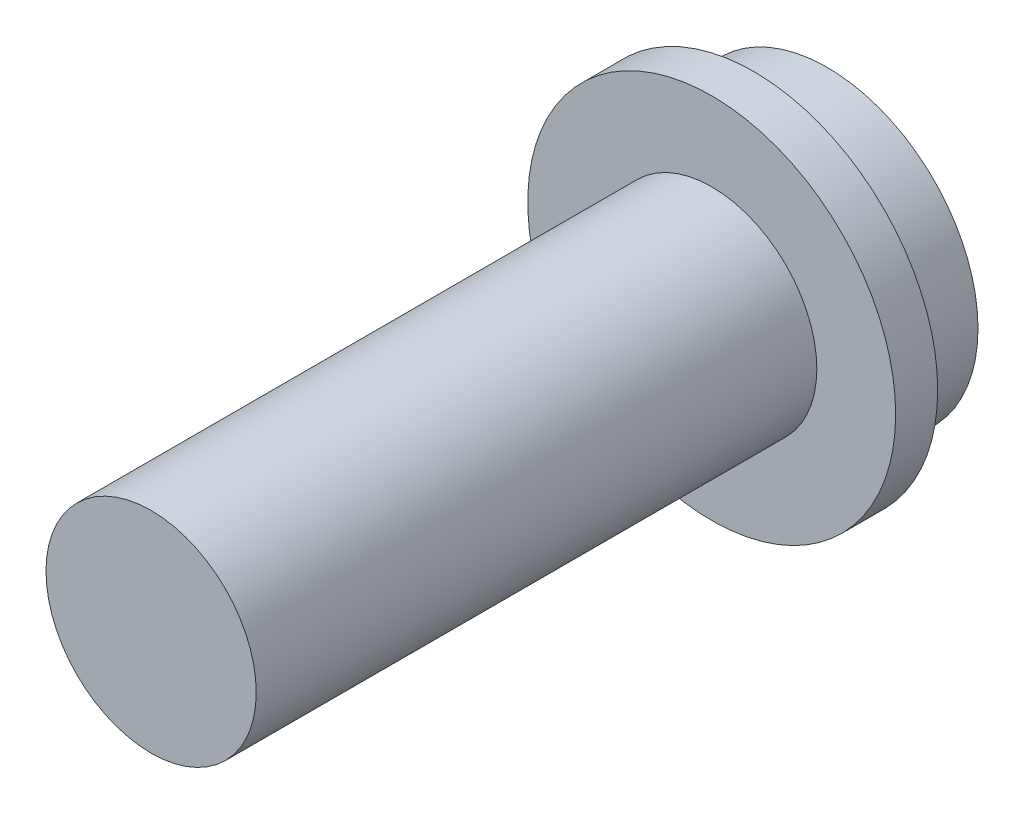
ISO-10303-21;
HEADER;
FILE_DESCRIPTION(('STEP AP214'),'2;1');
FILE_NAME('part.step','',(''),(''),'','','');
FILE_SCHEMA(('AUTOMOTIVE_DESIGN { 1 0 10303 214 1 1 1 1 }'));
ENDSEC;
DATA;
#1=APPLICATION_CONTEXT('core data for automotive mechanical design processes');
#2=APPLICATION_PROTOCOL_DEFINITION('international standard','automotive_design',2000,#1);
#3=PRODUCT_CONTEXT('',#1,'mechanical');
#4=PRODUCT('Part','Part','',(#3));
#5=PRODUCT_RELATED_PRODUCT_CATEGORY('part','',(#4));
#6=PRODUCT_DEFINITION_FORMATION('','',#4);
#7=PRODUCT_DEFINITION_CONTEXT('part definition',#1,'design');
#8=PRODUCT_DEFINITION('design','',#6,#7);
#9=PRODUCT_DEFINITION_SHAPE('','',#8);
#10=(LENGTH_UNIT() NAMED_UNIT(*) SI_UNIT(.MILLI.,.METRE.));
#11=(NAMED_UNIT(*) PLANE_ANGLE_UNIT() SI_UNIT($,.RADIAN.));
#12=(NAMED_UNIT(*) SI_UNIT($,.STERADIAN.) SOLID_ANGLE_UNIT());
#13=UNCERTAINTY_MEASURE_WITH_UNIT(LENGTH_MEASURE(1.E-05),#10,'distance_accuracy_value','');
#14=(GEOMETRIC_REPRESENTATION_CONTEXT(3) GLOBAL_UNCERTAINTY_ASSIGNED_CONTEXT((#13)) GLOBAL_UNIT_ASSIGNED_CONTEXT((#10,
#11,#12)) REPRESENTATION_CONTEXT('',''));
#15=CARTESIAN_POINT('',(0.,0.,0.));
#16=DIRECTION('',(0.,0.,1.));
#17=DIRECTION('',(1.,0.,0.));
#18=AXIS2_PLACEMENT_3D('',#15,#16,#17);
#19=CARTESIAN_POINT('',(0.,0.,-3.3));
#20=DIRECTION('',(0.,0.,1.));
#21=DIRECTION('',(1.,0.,0.));
#22=AXIS2_PLACEMENT_3D('',#19,#20,#21);
#23=PLANE('',#22);
#24=CARTESIAN_POINT('',(0.,0.,-3.3));
#25=DIRECTION('',(0.,0.,1.));
#26=DIRECTION('',(1.,0.,0.));
#27=AXIS2_PLACEMENT_3D('',#24,#25,#26);
#28=CIRCLE('',#27,4.3);
#29=CARTESIAN_POINT('',(4.3,0.,-3.3));
#30=VERTEX_POINT('',#29);
#31=EDGE_CURVE('E110',#30,#30,#28,.T.);
#32=ORIENTED_EDGE('',*,*,#31,.F.);
#33=EDGE_LOOP('',(#32));
#34=FACE_BOUND('',#33,.T.);
#35=DIRECTION('',(-0.5,-0.866025403784439,0.));
#36=VECTOR('',#35,1.);
#37=CARTESIAN_POINT('',(1.73205080756888,-1.,-3.3));
#38=LINE('',#37,#36);
#39=CARTESIAN_POINT('',(2.3094010767585,0.,-3.3));
#40=VERTEX_POINT('',#39);
#41=CARTESIAN_POINT('',(1.15470053837925,-2.,-3.3));
#42=VERTEX_POINT('',#41);
#43=EDGE_CURVE('E11',#40,#42,#38,.T.);
#44=ORIENTED_EDGE('',*,*,#43,.F.);
#45=DIRECTION('',(0.5,-0.866025403784439,0.));
#46=VECTOR('',#45,1.);
#47=CARTESIAN_POINT('',(1.73205080756888,1.,-3.3));
#48=LINE('',#47,#46);
#49=CARTESIAN_POINT('',(1.15470053837925,2.,-3.3));
#50=VERTEX_POINT('',#49);
#51=EDGE_CURVE('E50',#50,#40,#48,.T.);
#52=ORIENTED_EDGE('',*,*,#51,.F.);
#53=DIRECTION('',(1.,0.,0.));
#54=VECTOR('',#53,1.);
#55=CARTESIAN_POINT('',(0.,2.,-3.3));
#56=LINE('',#55,#54);
#57=CARTESIAN_POINT('',(-1.15470053837925,2.,-3.3));
#58=VERTEX_POINT('',#57);
#59=EDGE_CURVE('E140',#58,#50,#56,.T.);
#60=ORIENTED_EDGE('',*,*,#59,.F.);
#61=DIRECTION('',(0.5,0.866025403784438,0.));
#62=VECTOR('',#61,1.);
#63=CARTESIAN_POINT('',(-1.73205080756888,1.,-3.3));
#64=LINE('',#63,#62);
#65=CARTESIAN_POINT('',(-2.3094010767585,0.,-3.3));
#66=VERTEX_POINT('',#65);
#67=EDGE_CURVE('E133',#66,#58,#64,.T.);
#68=ORIENTED_EDGE('',*,*,#67,.F.);
#69=DIRECTION('',(-0.5,0.866025403784439,0.));
#70=VECTOR('',#69,1.);
#71=CARTESIAN_POINT('',(-1.73205080756888,-1.,-3.3));
#72=LINE('',#71,#70);
#73=CARTESIAN_POINT('',(-1.15470053837925,-2.,-3.3));
#74=VERTEX_POINT('',#73);
#75=EDGE_CURVE('E135',#74,#66,#72,.T.);
#76=ORIENTED_EDGE('',*,*,#75,.F.);
#77=DIRECTION('',(-1.,0.,0.));
#78=VECTOR('',#77,1.);
#79=CARTESIAN_POINT('',(0.,-2.,-3.3));
#80=LINE('',#79,#78);
#81=EDGE_CURVE('E126',#42,#74,#80,.T.);
#82=ORIENTED_EDGE('',*,*,#81,.F.);
#83=EDGE_LOOP('',(#44,#52,#60,#68,#76,#82));
#84=FACE_BOUND('',#83,.T.);
#85=ADVANCED_FACE('F39',(#34,#84),#23,.F.);
#86=CARTESIAN_POINT('',(0.,0.,16.));
#87=DIRECTION('',(0.,0.,-1.));
#88=DIRECTION('',(-1.,0.,0.));
#89=AXIS2_PLACEMENT_3D('',#86,#87,#88);
#90=CYLINDRICAL_SURFACE('',#89,3.);
#91=CARTESIAN_POINT('',(0.,0.,16.));
#92=DIRECTION('',(0.,0.,1.));
#93=DIRECTION('',(1.,0.,0.));
#94=AXIS2_PLACEMENT_3D('',#91,#92,#93);
#95=CIRCLE('',#94,3.);
#96=CARTESIAN_POINT('',(3.,0.,16.));
#97=VERTEX_POINT('',#96);
#98=EDGE_CURVE('E127',#97,#97,#95,.T.);
#99=ORIENTED_EDGE('',*,*,#98,.F.);
#100=EDGE_LOOP('',(#99));
#101=FACE_BOUND('',#100,.T.);
#102=CARTESIAN_POINT('',(0.,0.,0.));
#103=DIRECTION('',(0.,0.,1.));
#104=DIRECTION('',(1.,0.,0.));
#105=AXIS2_PLACEMENT_3D('',#102,#103,#104);
#106=CIRCLE('',#105,3.);
#107=CARTESIAN_POINT('',(3.,0.,0.));
#108=VERTEX_POINT('',#107);
#109=EDGE_CURVE('E124',#108,#108,#106,.T.);
#110=ORIENTED_EDGE('',*,*,#109,.T.);
#111=EDGE_LOOP('',(#110));
#112=FACE_BOUND('',#111,.T.);
#113=ADVANCED_FACE('F41',(#101,#112),#90,.T.);
#114=CARTESIAN_POINT('',(0.,0.,16.));
#115=DIRECTION('',(0.,0.,1.));
#116=DIRECTION('',(1.,0.,0.));
#117=AXIS2_PLACEMENT_3D('',#114,#115,#116);
#118=PLANE('',#117);
#119=ORIENTED_EDGE('',*,*,#98,.T.);
#120=EDGE_LOOP('',(#119));
#121=FACE_BOUND('',#120,.T.);
#122=ADVANCED_FACE('F184',(#121),#118,.T.);
#123=CARTESIAN_POINT('',(0.,0.,0.));
#124=DIRECTION('',(0.,0.,-1.));
#125=DIRECTION('',(-1.,0.,0.));
#126=AXIS2_PLACEMENT_3D('',#123,#124,#125);
#127=CYLINDRICAL_SURFACE('',#126,5.25);
#128=CARTESIAN_POINT('',(0.,0.,0.));
#129=DIRECTION('',(0.,0.,1.));
#130=DIRECTION('',(1.,0.,0.));
#131=AXIS2_PLACEMENT_3D('',#128,#129,#130);
#132=CIRCLE('',#131,5.25);
#133=CARTESIAN_POINT('',(5.25,0.,0.));
#134=VERTEX_POINT('',#133);
#135=EDGE_CURVE('E119',#134,#134,#132,.T.);
#136=ORIENTED_EDGE('',*,*,#135,.F.);
#137=EDGE_LOOP('',(#136));
#138=FACE_BOUND('',#137,.T.);
#139=CARTESIAN_POINT('',(0.,0.,-1.2));
#140=DIRECTION('',(0.,0.,1.));
#141=DIRECTION('',(1.,0.,0.));
#142=AXIS2_PLACEMENT_3D('',#139,#140,#141);
#143=CIRCLE('',#142,5.25);
#144=CARTESIAN_POINT('',(5.25,0.,-1.2));
#145=VERTEX_POINT('',#144);
#146=EDGE_CURVE('E117',#145,#145,#143,.T.);
#147=ORIENTED_EDGE('',*,*,#146,.T.);
#148=EDGE_LOOP('',(#147));
#149=FACE_BOUND('',#148,.T.);
#150=ADVANCED_FACE('F200',(#138,#149),#127,.T.);
#151=CARTESIAN_POINT('',(0.,0.,0.));
#152=DIRECTION('',(0.,0.,1.));
#153=DIRECTION('',(1.,0.,0.));
#154=AXIS2_PLACEMENT_3D('',#151,#152,#153);
#155=PLANE('',#154);
#156=ORIENTED_EDGE('',*,*,#109,.F.);
#157=EDGE_LOOP('',(#156));
#158=FACE_BOUND('',#157,.T.);
#159=ORIENTED_EDGE('',*,*,#135,.T.);
#160=EDGE_LOOP('',(#159));
#161=FACE_BOUND('',#160,.T.);
#162=ADVANCED_FACE('F193',(#158,#161),#155,.T.);
#163=CARTESIAN_POINT('',(0.,0.,-1.2));
#164=DIRECTION('',(0.,0.,1.));
#165=DIRECTION('',(1.,0.,0.));
#166=AXIS2_PLACEMENT_3D('',#163,#164,#165);
#167=PLANE('',#166);
#168=CARTESIAN_POINT('',(0.,0.,-1.2));
#169=DIRECTION('',(0.,0.,1.));
#170=DIRECTION('',(1.,0.,0.));
#171=AXIS2_PLACEMENT_3D('',#168,#169,#170);
#172=CIRCLE('',#171,4.3);
#173=CARTESIAN_POINT('',(4.3,0.,-1.2));
#174=VERTEX_POINT('',#173);
#175=EDGE_CURVE('E111',#174,#174,#172,.T.);
#176=ORIENTED_EDGE('',*,*,#175,.T.);
#177=EDGE_LOOP('',(#176));
#178=FACE_BOUND('',#177,.T.);
#179=ORIENTED_EDGE('',*,*,#146,.F.);
#180=EDGE_LOOP('',(#179));
#181=FACE_BOUND('',#180,.T.);
#182=ADVANCED_FACE('F194',(#178,#181),#167,.F.);
#183=CARTESIAN_POINT('',(0.,0.,-1.2));
#184=DIRECTION('',(0.,0.,-1.));
#185=DIRECTION('',(-1.,0.,0.));
#186=AXIS2_PLACEMENT_3D('',#183,#184,#185);
#187=CYLINDRICAL_SURFACE('',#186,4.3);
#188=ORIENTED_EDGE('',*,*,#175,.F.);
#189=EDGE_LOOP('',(#188));
#190=FACE_BOUND('',#189,.T.);
#191=ORIENTED_EDGE('',*,*,#31,.T.);
#192=EDGE_LOOP('',(#191));
#193=FACE_BOUND('',#192,.T.);
#194=ADVANCED_FACE('F192',(#190,#193),#187,.T.);
#195=CARTESIAN_POINT('',(1.15470053837925,-2.,-1.2));
#196=DIRECTION('',(-0.866025403784439,0.5,0.));
#197=DIRECTION('',(-0.5,-0.866025403784439,0.));
#198=AXIS2_PLACEMENT_3D('',#195,#196,#197);
#199=PLANE('',#198);
#200=ORIENTED_EDGE('',*,*,#43,.T.);
#201=DIRECTION('',(0.,0.,-1.));
#202=VECTOR('',#201,1.);
#203=CARTESIAN_POINT('',(1.15470053837925,-2.,-1.2));
#204=LINE('',#203,#202);
#205=CARTESIAN_POINT('',(1.15470053837925,-2.,-1.2));
#206=VERTEX_POINT('',#205);
#207=EDGE_CURVE('E53',#206,#42,#204,.T.);
#208=ORIENTED_EDGE('',*,*,#207,.F.);
#209=DIRECTION('',(0.5,0.866025403784439,0.));
#210=VECTOR('',#209,1.);
#211=CARTESIAN_POINT('',(1.15470053837925,-2.,-1.2));
#212=LINE('',#211,#210);
#213=CARTESIAN_POINT('',(2.3094010767585,0.,-1.2));
#214=VERTEX_POINT('',#213);
#215=EDGE_CURVE('E98',#206,#214,#212,.T.);
#216=ORIENTED_EDGE('',*,*,#215,.T.);
#217=DIRECTION('',(0.,0.,-1.));
#218=VECTOR('',#217,1.);
#219=CARTESIAN_POINT('',(2.3094010767585,0.,-1.2));
#220=LINE('',#219,#218);
#221=EDGE_CURVE('E101',#214,#40,#220,.T.);
#222=ORIENTED_EDGE('',*,*,#221,.T.);
#223=EDGE_LOOP('',(#200,#208,#216,#222));
#224=FACE_BOUND('',#223,.T.);
#225=ADVANCED_FACE('F105',(#224),#199,.T.);
#226=CARTESIAN_POINT('',(2.3094010767585,0.,-1.2));
#227=DIRECTION('',(-0.866025403784439,-0.5,0.));
#228=DIRECTION('',(0.5,-0.866025403784439,0.));
#229=AXIS2_PLACEMENT_3D('',#226,#227,#228);
#230=PLANE('',#229);
#231=ORIENTED_EDGE('',*,*,#51,.T.);
#232=ORIENTED_EDGE('',*,*,#221,.F.);
#233=DIRECTION('',(-0.5,0.866025403784439,0.));
#234=VECTOR('',#233,1.);
#235=CARTESIAN_POINT('',(2.3094010767585,0.,-1.2));
#236=LINE('',#235,#234);
#237=CARTESIAN_POINT('',(1.15470053837925,2.,-1.2));
#238=VERTEX_POINT('',#237);
#239=EDGE_CURVE('E95',#214,#238,#236,.T.);
#240=ORIENTED_EDGE('',*,*,#239,.T.);
#241=DIRECTION('',(0.,0.,-1.));
#242=VECTOR('',#241,1.);
#243=CARTESIAN_POINT('',(1.15470053837925,2.,-1.2));
#244=LINE('',#243,#242);
#245=EDGE_CURVE('E108',#238,#50,#244,.T.);
#246=ORIENTED_EDGE('',*,*,#245,.T.);
#247=EDGE_LOOP('',(#231,#232,#240,#246));
#248=FACE_BOUND('',#247,.T.);
#249=ADVANCED_FACE('F106',(#248),#230,.T.);
#250=CARTESIAN_POINT('',(1.15470053837925,2.,-1.2));
#251=DIRECTION('',(0.,-1.,0.));
#252=DIRECTION('',(1.,0.,0.));
#253=AXIS2_PLACEMENT_3D('',#250,#251,#252);
#254=PLANE('',#253);
#255=ORIENTED_EDGE('',*,*,#59,.T.);
#256=ORIENTED_EDGE('',*,*,#245,.F.);
#257=DIRECTION('',(-1.,0.,0.));
#258=VECTOR('',#257,1.);
#259=CARTESIAN_POINT('',(1.15470053837925,2.,-1.2));
#260=LINE('',#259,#258);
#261=CARTESIAN_POINT('',(-1.15470053837925,2.,-1.2));
#262=VERTEX_POINT('',#261);
#263=EDGE_CURVE('E96',#238,#262,#260,.T.);
#264=ORIENTED_EDGE('',*,*,#263,.T.);
#265=DIRECTION('',(0.,0.,-1.));
#266=VECTOR('',#265,1.);
#267=CARTESIAN_POINT('',(-1.15470053837925,2.,-1.2));
#268=LINE('',#267,#266);
#269=EDGE_CURVE('E113',#262,#58,#268,.T.);
#270=ORIENTED_EDGE('',*,*,#269,.T.);
#271=EDGE_LOOP('',(#255,#256,#264,#270));
#272=FACE_BOUND('',#271,.T.);
#273=ADVANCED_FACE('F142',(#272),#254,.T.);
#274=CARTESIAN_POINT('',(-1.15470053837925,2.,-1.2));
#275=DIRECTION('',(0.866025403784438,-0.5,0.));
#276=DIRECTION('',(0.5,0.866025403784438,0.));
#277=AXIS2_PLACEMENT_3D('',#274,#275,#276);
#278=PLANE('',#277);
#279=ORIENTED_EDGE('',*,*,#67,.T.);
#280=ORIENTED_EDGE('',*,*,#269,.F.);
#281=DIRECTION('',(-0.5,-0.866025403784438,0.));
#282=VECTOR('',#281,1.);
#283=CARTESIAN_POINT('',(-1.15470053837925,2.,-1.2));
#284=LINE('',#283,#282);
#285=CARTESIAN_POINT('',(-2.3094010767585,0.,-1.2));
#286=VERTEX_POINT('',#285);
#287=EDGE_CURVE('E164',#262,#286,#284,.T.);
#288=ORIENTED_EDGE('',*,*,#287,.T.);
#289=DIRECTION('',(0.,0.,-1.));
#290=VECTOR('',#289,1.);
#291=CARTESIAN_POINT('',(-2.3094010767585,0.,-1.2));
#292=LINE('',#291,#290);
#293=EDGE_CURVE('E160',#286,#66,#292,.T.);
#294=ORIENTED_EDGE('',*,*,#293,.T.);
#295=EDGE_LOOP('',(#279,#280,#288,#294));
#296=FACE_BOUND('',#295,.T.);
#297=ADVANCED_FACE('F166',(#296),#278,.T.);
#298=CARTESIAN_POINT('',(-2.3094010767585,0.,-1.2));
#299=DIRECTION('',(0.866025403784439,0.5,0.));
#300=DIRECTION('',(-0.5,0.866025403784439,0.));
#301=AXIS2_PLACEMENT_3D('',#298,#299,#300);
#302=PLANE('',#301);
#303=ORIENTED_EDGE('',*,*,#75,.T.);
#304=ORIENTED_EDGE('',*,*,#293,.F.);
#305=DIRECTION('',(0.5,-0.866025403784439,0.));
#306=VECTOR('',#305,1.);
#307=CARTESIAN_POINT('',(-2.3094010767585,0.,-1.2));
#308=LINE('',#307,#306);
#309=CARTESIAN_POINT('',(-1.15470053837925,-2.,-1.2));
#310=VERTEX_POINT('',#309);
#311=EDGE_CURVE('E157',#286,#310,#308,.T.);
#312=ORIENTED_EDGE('',*,*,#311,.T.);
#313=DIRECTION('',(0.,0.,-1.));
#314=VECTOR('',#313,1.);
#315=CARTESIAN_POINT('',(-1.15470053837925,-2.,-1.2));
#316=LINE('',#315,#314);
#317=EDGE_CURVE('E148',#310,#74,#316,.T.);
#318=ORIENTED_EDGE('',*,*,#317,.T.);
#319=EDGE_LOOP('',(#303,#304,#312,#318));
#320=FACE_BOUND('',#319,.T.);
#321=ADVANCED_FACE('F154',(#320),#302,.T.);
#322=CARTESIAN_POINT('',(-1.15470053837925,-2.,-1.2));
#323=DIRECTION('',(0.,1.,0.));
#324=DIRECTION('',(-1.,0.,0.));
#325=AXIS2_PLACEMENT_3D('',#322,#323,#324);
#326=PLANE('',#325);
#327=ORIENTED_EDGE('',*,*,#81,.T.);
#328=ORIENTED_EDGE('',*,*,#317,.F.);
#329=DIRECTION('',(1.,0.,0.));
#330=VECTOR('',#329,1.);
#331=CARTESIAN_POINT('',(-1.15470053837925,-2.,-1.2));
#332=LINE('',#331,#330);
#333=EDGE_CURVE('E156',#310,#206,#332,.T.);
#334=ORIENTED_EDGE('',*,*,#333,.T.);
#335=ORIENTED_EDGE('',*,*,#207,.T.);
#336=EDGE_LOOP('',(#327,#328,#334,#335));
#337=FACE_BOUND('',#336,.T.);
#338=ADVANCED_FACE('F146',(#337),#326,.T.);
#339=CARTESIAN_POINT('',(0.,0.,-1.2));
#340=DIRECTION('',(0.,0.,1.));
#341=DIRECTION('',(1.,0.,0.));
#342=AXIS2_PLACEMENT_3D('',#339,#340,#341);
#343=PLANE('',#342);
#344=ORIENTED_EDGE('',*,*,#215,.F.);
#345=ORIENTED_EDGE('',*,*,#333,.F.);
#346=ORIENTED_EDGE('',*,*,#311,.F.);
#347=ORIENTED_EDGE('',*,*,#287,.F.);
#348=ORIENTED_EDGE('',*,*,#263,.F.);
#349=ORIENTED_EDGE('',*,*,#239,.F.);
#350=EDGE_LOOP('',(#344,#345,#346,#347,#348,#349));
#351=FACE_BOUND('',#350,.T.);
#352=ADVANCED_FACE('F94',(#351),#343,.F.);
#353=CLOSED_SHELL('',(#85,#113,#122,#150,#162,#182,#194,#225,#249,#273,#297,#321,#338,#352));
#354=MANIFOLD_SOLID_BREP('B2',#353);
#355=ADVANCED_BREP_SHAPE_REPRESENTATION('',(#18,#354),#14);
#356=SHAPE_DEFINITION_REPRESENTATION(#9,#355);
ENDSEC;
END-ISO-10303-21;
